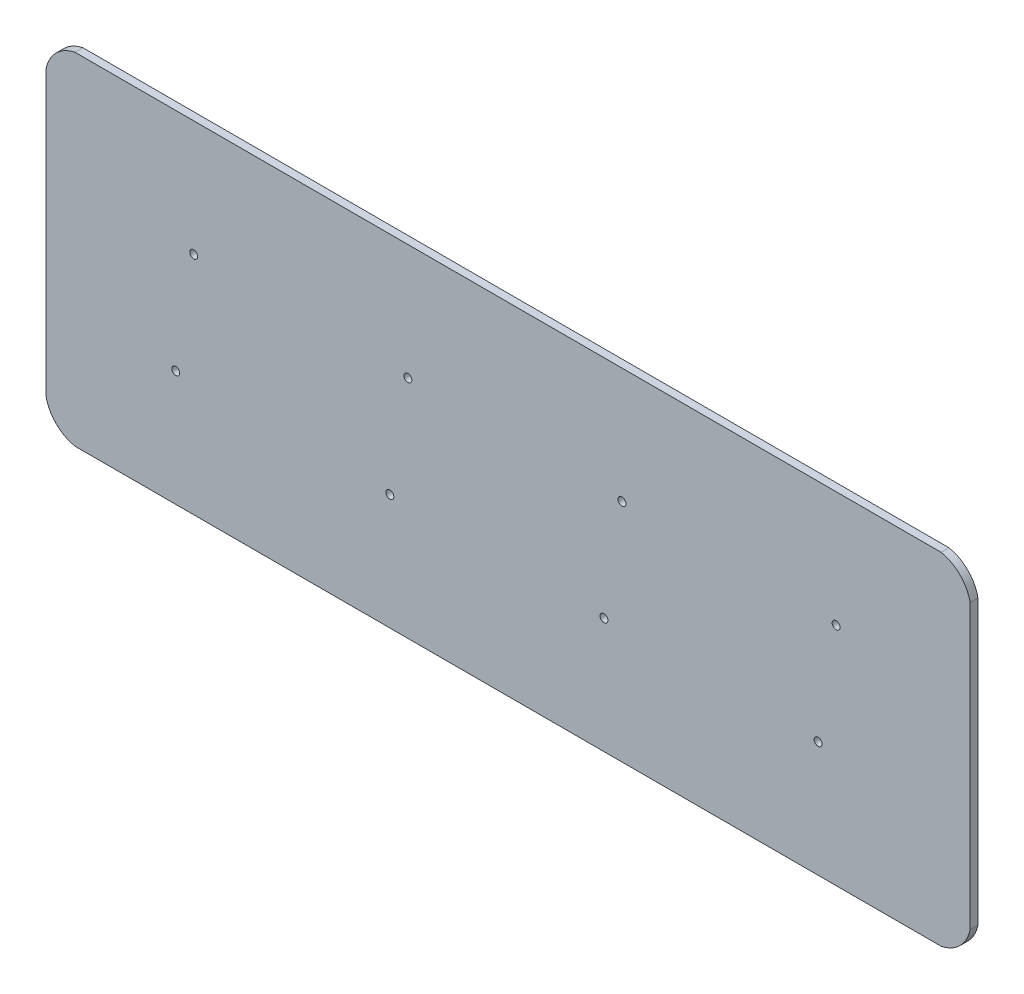
ISO-10303-21;
HEADER;
FILE_DESCRIPTION(('STEP AP214'),'2;1');
FILE_NAME('part.step','',(''),(''),'','','');
FILE_SCHEMA(('AUTOMOTIVE_DESIGN { 1 0 10303 214 1 1 1 1 }'));
ENDSEC;
DATA;
#1=APPLICATION_CONTEXT('core data for automotive mechanical design processes');
#2=APPLICATION_PROTOCOL_DEFINITION('international standard','automotive_design',2000,#1);
#3=PRODUCT_CONTEXT('',#1,'mechanical');
#4=PRODUCT('Part','Part','',(#3));
#5=PRODUCT_RELATED_PRODUCT_CATEGORY('part','',(#4));
#6=PRODUCT_DEFINITION_FORMATION('','',#4);
#7=PRODUCT_DEFINITION_CONTEXT('part definition',#1,'design');
#8=PRODUCT_DEFINITION('design','',#6,#7);
#9=PRODUCT_DEFINITION_SHAPE('','',#8);
#10=(LENGTH_UNIT() NAMED_UNIT(*) SI_UNIT(.MILLI.,.METRE.));
#11=(NAMED_UNIT(*) PLANE_ANGLE_UNIT() SI_UNIT($,.RADIAN.));
#12=(NAMED_UNIT(*) SI_UNIT($,.STERADIAN.) SOLID_ANGLE_UNIT());
#13=UNCERTAINTY_MEASURE_WITH_UNIT(LENGTH_MEASURE(1.E-05),#10,'distance_accuracy_value','');
#14=(GEOMETRIC_REPRESENTATION_CONTEXT(3) GLOBAL_UNCERTAINTY_ASSIGNED_CONTEXT((#13)) GLOBAL_UNIT_ASSIGNED_CONTEXT((#10,
#11,#12)) REPRESENTATION_CONTEXT('',''));
#15=CARTESIAN_POINT('',(0.,0.,0.));
#16=DIRECTION('',(0.,0.,1.));
#17=DIRECTION('',(1.,0.,0.));
#18=AXIS2_PLACEMENT_3D('',#15,#16,#17);
#19=CARTESIAN_POINT('',(167.144881817433,53.762164788374,3.));
#20=DIRECTION('',(0.,0.,1.));
#21=DIRECTION('',(1.,0.,0.));
#22=AXIS2_PLACEMENT_3D('',#19,#20,#21);
#23=PLANE('',#22);
#24=CARTESIAN_POINT('',(129.825109101699,23.4531392435407,3.));
#25=DIRECTION('',(0.,0.,1.));
#26=DIRECTION('',(1.,0.,0.));
#27=AXIS2_PLACEMENT_3D('',#24,#25,#26);
#28=CIRCLE('',#27,1.5);
#29=CARTESIAN_POINT('',(131.325109101699,23.4531392435407,3.));
#30=VERTEX_POINT('',#29);
#31=EDGE_CURVE('E215',#30,#30,#28,.T.);
#32=ORIENTED_EDGE('',*,*,#31,.F.);
#33=EDGE_LOOP('',(#32));
#34=FACE_BOUND('',#33,.T.);
#35=CARTESIAN_POINT('',(48.2351091016995,23.4531392435407,3.));
#36=DIRECTION('',(0.,0.,1.));
#37=DIRECTION('',(1.,0.,0.));
#38=AXIS2_PLACEMENT_3D('',#35,#36,#37);
#39=CIRCLE('',#38,1.5);
#40=CARTESIAN_POINT('',(49.7351091016995,23.4531392435407,3.));
#41=VERTEX_POINT('',#40);
#42=EDGE_CURVE('E203',#41,#41,#39,.T.);
#43=ORIENTED_EDGE('',*,*,#42,.F.);
#44=EDGE_LOOP('',(#43));
#45=FACE_BOUND('',#44,.T.);
#46=CARTESIAN_POINT('',(-33.3548908983005,23.4531392435407,3.));
#47=DIRECTION('',(0.,0.,1.));
#48=DIRECTION('',(1.,0.,0.));
#49=AXIS2_PLACEMENT_3D('',#46,#47,#48);
#50=CIRCLE('',#49,1.5);
#51=CARTESIAN_POINT('',(-31.8548908983005,23.4531392435407,3.));
#52=VERTEX_POINT('',#51);
#53=EDGE_CURVE('E191',#52,#52,#50,.T.);
#54=ORIENTED_EDGE('',*,*,#53,.F.);
#55=EDGE_LOOP('',(#54));
#56=FACE_BOUND('',#55,.T.);
#57=CARTESIAN_POINT('',(-114.944890898301,23.4531392435407,3.));
#58=DIRECTION('',(0.,0.,1.));
#59=DIRECTION('',(1.,0.,0.));
#60=AXIS2_PLACEMENT_3D('',#57,#58,#59);
#61=CIRCLE('',#60,1.5);
#62=CARTESIAN_POINT('',(-113.444890898301,23.4531392435407,3.));
#63=VERTEX_POINT('',#62);
#64=EDGE_CURVE('E137',#63,#63,#61,.T.);
#65=ORIENTED_EDGE('',*,*,#64,.F.);
#66=EDGE_LOOP('',(#65));
#67=FACE_BOUND('',#66,.T.);
#68=CARTESIAN_POINT('',(167.144881817433,53.762164788374,3.));
#69=DIRECTION('',(0.,0.,1.));
#70=DIRECTION('',(1.,0.,0.));
#71=AXIS2_PLACEMENT_3D('',#68,#69,#70);
#72=CIRCLE('',#71,14.0000000000001);
#73=CARTESIAN_POINT('',(180.8858562726,56.4427656580404,3.));
#74=VERTEX_POINT('',#73);
#75=CARTESIAN_POINT('',(169.825482687099,67.5031392435407,3.));
#76=VERTEX_POINT('',#75);
#77=EDGE_CURVE('E148',#74,#76,#72,.T.);
#78=ORIENTED_EDGE('',*,*,#77,.T.);
#79=DIRECTION('',(-1.,0.,0.));
#80=VECTOR('',#79,1.);
#81=CARTESIAN_POINT('',(169.825482687099,67.5031392435407,3.));
#82=LINE('',#81,#80);
#83=CARTESIAN_POINT('',(-160.174517312901,67.5031392435407,3.));
#84=VERTEX_POINT('',#83);
#85=EDGE_CURVE('E96',#76,#84,#82,.T.);
#86=ORIENTED_EDGE('',*,*,#85,.T.);
#87=CARTESIAN_POINT('',(-157.49391644315,53.7621647883903,3.));
#88=DIRECTION('',(0.,0.,1.));
#89=DIRECTION('',(1.,0.,0.));
#90=AXIS2_PLACEMENT_3D('',#87,#88,#89);
#91=CIRCLE('',#90,14.0000000000001);
#92=CARTESIAN_POINT('',(-171.234890898301,56.4427656581409,3.));
#93=VERTEX_POINT('',#92);
#94=EDGE_CURVE('E163',#84,#93,#91,.T.);
#95=ORIENTED_EDGE('',*,*,#94,.T.);
#96=DIRECTION('',(0.,-1.,0.));
#97=VECTOR('',#96,1.);
#98=CARTESIAN_POINT('',(-171.234890898301,56.4427656581409,3.));
#99=LINE('',#98,#97);
#100=CARTESIAN_POINT('',(-171.234890898301,-51.4364871710593,3.));
#101=VERTEX_POINT('',#100);
#102=EDGE_CURVE('E176',#93,#101,#99,.T.);
#103=ORIENTED_EDGE('',*,*,#102,.T.);
#104=CARTESIAN_POINT('',(-157.49391644315,-48.7558863013089,3.));
#105=DIRECTION('',(0.,0.,1.));
#106=DIRECTION('',(1.,0.,0.));
#107=AXIS2_PLACEMENT_3D('',#104,#105,#106);
#108=CIRCLE('',#107,14.);
#109=CARTESIAN_POINT('',(-160.1745173129,-62.4968607564593,3.));
#110=VERTEX_POINT('',#109);
#111=EDGE_CURVE('E115',#101,#110,#108,.T.);
#112=ORIENTED_EDGE('',*,*,#111,.T.);
#113=DIRECTION('',(1.,0.,0.));
#114=VECTOR('',#113,1.);
#115=CARTESIAN_POINT('',(-160.1745173129,-62.4968607564593,3.));
#116=LINE('',#115,#114);
#117=CARTESIAN_POINT('',(169.825482687099,-62.4968607564592,3.));
#118=VERTEX_POINT('',#117);
#119=EDGE_CURVE('E109',#110,#118,#116,.T.);
#120=ORIENTED_EDGE('',*,*,#119,.T.);
#121=CARTESIAN_POINT('',(167.144881817453,-48.7558863012886,3.));
#122=DIRECTION('',(0.,0.,1.));
#123=DIRECTION('',(1.,0.,0.));
#124=AXIS2_PLACEMENT_3D('',#121,#122,#123);
#125=CIRCLE('',#124,14.);
#126=CARTESIAN_POINT('',(180.8858562726,-51.4364871710588,3.));
#127=VERTEX_POINT('',#126);
#128=EDGE_CURVE('E113',#118,#127,#125,.T.);
#129=ORIENTED_EDGE('',*,*,#128,.T.);
#130=DIRECTION('',(0.,1.,0.));
#131=VECTOR('',#130,1.);
#132=CARTESIAN_POINT('',(180.8858562726,-51.4364871710588,3.));
#133=LINE('',#132,#131);
#134=EDGE_CURVE('E53',#127,#74,#133,.T.);
#135=ORIENTED_EDGE('',*,*,#134,.T.);
#136=EDGE_LOOP('',(#78,#86,#95,#103,#112,#120,#129,#135));
#137=FACE_BOUND('',#136,.T.);
#138=CARTESIAN_POINT('',(-121.804890898301,-18.4568607564593,3.));
#139=DIRECTION('',(0.,0.,1.));
#140=DIRECTION('',(1.,0.,0.));
#141=AXIS2_PLACEMENT_3D('',#138,#139,#140);
#142=CIRCLE('',#141,1.5);
#143=CARTESIAN_POINT('',(-120.304890898301,-18.4568607564593,3.));
#144=VERTEX_POINT('',#143);
#145=EDGE_CURVE('E185',#144,#144,#142,.T.);
#146=ORIENTED_EDGE('',*,*,#145,.F.);
#147=EDGE_LOOP('',(#146));
#148=FACE_BOUND('',#147,.T.);
#149=CARTESIAN_POINT('',(-40.2148908983005,-18.4568607564593,3.));
#150=DIRECTION('',(0.,0.,1.));
#151=DIRECTION('',(1.,0.,0.));
#152=AXIS2_PLACEMENT_3D('',#149,#150,#151);
#153=CIRCLE('',#152,1.5);
#154=CARTESIAN_POINT('',(-38.7148908983005,-18.4568607564593,3.));
#155=VERTEX_POINT('',#154);
#156=EDGE_CURVE('E197',#155,#155,#153,.T.);
#157=ORIENTED_EDGE('',*,*,#156,.F.);
#158=EDGE_LOOP('',(#157));
#159=FACE_BOUND('',#158,.T.);
#160=CARTESIAN_POINT('',(41.3751091016995,-18.4568607564593,3.));
#161=DIRECTION('',(0.,0.,1.));
#162=DIRECTION('',(1.,0.,0.));
#163=AXIS2_PLACEMENT_3D('',#160,#161,#162);
#164=CIRCLE('',#163,1.5);
#165=CARTESIAN_POINT('',(42.8751091016995,-18.4568607564593,3.));
#166=VERTEX_POINT('',#165);
#167=EDGE_CURVE('E209',#166,#166,#164,.T.);
#168=ORIENTED_EDGE('',*,*,#167,.F.);
#169=EDGE_LOOP('',(#168));
#170=FACE_BOUND('',#169,.T.);
#171=CARTESIAN_POINT('',(122.9651091017,-18.4568607564593,3.));
#172=DIRECTION('',(0.,0.,1.));
#173=DIRECTION('',(1.,0.,0.));
#174=AXIS2_PLACEMENT_3D('',#171,#172,#173);
#175=CIRCLE('',#174,1.5);
#176=CARTESIAN_POINT('',(124.4651091017,-18.4568607564593,3.));
#177=VERTEX_POINT('',#176);
#178=EDGE_CURVE('E221',#177,#177,#175,.T.);
#179=ORIENTED_EDGE('',*,*,#178,.F.);
#180=EDGE_LOOP('',(#179));
#181=FACE_BOUND('',#180,.T.);
#182=ADVANCED_FACE('F36',(#34,#45,#56,#67,#137,#148,#159,#170,#181),#23,.T.);
#183=CARTESIAN_POINT('',(167.144881817433,53.762164788374,0.));
#184=DIRECTION('',(0.,0.,1.));
#185=DIRECTION('',(1.,0.,0.));
#186=AXIS2_PLACEMENT_3D('',#183,#184,#185);
#187=PLANE('',#186);
#188=CARTESIAN_POINT('',(167.144881817433,53.762164788374,0.));
#189=DIRECTION('',(0.,0.,1.));
#190=DIRECTION('',(1.,0.,0.));
#191=AXIS2_PLACEMENT_3D('',#188,#189,#190);
#192=CIRCLE('',#191,14.0000000000001);
#193=CARTESIAN_POINT('',(180.8858562726,56.4427656580404,0.));
#194=VERTEX_POINT('',#193);
#195=CARTESIAN_POINT('',(169.825482687099,67.5031392435407,0.));
#196=VERTEX_POINT('',#195);
#197=EDGE_CURVE('E133',#194,#196,#192,.T.);
#198=ORIENTED_EDGE('',*,*,#197,.F.);
#199=DIRECTION('',(0.,1.,0.));
#200=VECTOR('',#199,1.);
#201=CARTESIAN_POINT('',(180.8858562726,-51.4364871710588,0.));
#202=LINE('',#201,#200);
#203=CARTESIAN_POINT('',(180.8858562726,-51.4364871710588,0.));
#204=VERTEX_POINT('',#203);
#205=EDGE_CURVE('E88',#204,#194,#202,.T.);
#206=ORIENTED_EDGE('',*,*,#205,.F.);
#207=CARTESIAN_POINT('',(167.144881817453,-48.7558863012886,0.));
#208=DIRECTION('',(0.,0.,1.));
#209=DIRECTION('',(1.,0.,0.));
#210=AXIS2_PLACEMENT_3D('',#207,#208,#209);
#211=CIRCLE('',#210,14.);
#212=CARTESIAN_POINT('',(169.825482687099,-62.4968607564592,0.));
#213=VERTEX_POINT('',#212);
#214=EDGE_CURVE('E82',#213,#204,#211,.T.);
#215=ORIENTED_EDGE('',*,*,#214,.F.);
#216=DIRECTION('',(1.,0.,0.));
#217=VECTOR('',#216,1.);
#218=CARTESIAN_POINT('',(-160.1745173129,-62.4968607564593,0.));
#219=LINE('',#218,#217);
#220=CARTESIAN_POINT('',(-160.1745173129,-62.4968607564593,0.));
#221=VERTEX_POINT('',#220);
#222=EDGE_CURVE('E123',#221,#213,#219,.T.);
#223=ORIENTED_EDGE('',*,*,#222,.F.);
#224=CARTESIAN_POINT('',(-157.49391644315,-48.7558863013089,0.));
#225=DIRECTION('',(0.,0.,1.));
#226=DIRECTION('',(1.,0.,0.));
#227=AXIS2_PLACEMENT_3D('',#224,#225,#226);
#228=CIRCLE('',#227,14.);
#229=CARTESIAN_POINT('',(-171.234890898301,-51.4364871710593,0.));
#230=VERTEX_POINT('',#229);
#231=EDGE_CURVE('E143',#230,#221,#228,.T.);
#232=ORIENTED_EDGE('',*,*,#231,.F.);
#233=DIRECTION('',(0.,-1.,0.));
#234=VECTOR('',#233,1.);
#235=CARTESIAN_POINT('',(-171.234890898301,56.4427656581409,0.));
#236=LINE('',#235,#234);
#237=CARTESIAN_POINT('',(-171.234890898301,56.4427656581409,0.));
#238=VERTEX_POINT('',#237);
#239=EDGE_CURVE('E141',#238,#230,#236,.T.);
#240=ORIENTED_EDGE('',*,*,#239,.F.);
#241=CARTESIAN_POINT('',(-157.49391644315,53.7621647883903,0.));
#242=DIRECTION('',(0.,0.,1.));
#243=DIRECTION('',(1.,0.,0.));
#244=AXIS2_PLACEMENT_3D('',#241,#242,#243);
#245=CIRCLE('',#244,14.0000000000001);
#246=CARTESIAN_POINT('',(-160.174517312901,67.5031392435407,0.));
#247=VERTEX_POINT('',#246);
#248=EDGE_CURVE('E139',#247,#238,#245,.T.);
#249=ORIENTED_EDGE('',*,*,#248,.F.);
#250=DIRECTION('',(-1.,0.,0.));
#251=VECTOR('',#250,1.);
#252=CARTESIAN_POINT('',(169.825482687099,67.5031392435407,0.));
#253=LINE('',#252,#251);
#254=EDGE_CURVE('E136',#196,#247,#253,.T.);
#255=ORIENTED_EDGE('',*,*,#254,.F.);
#256=EDGE_LOOP('',(#198,#206,#215,#223,#232,#240,#249,#255));
#257=FACE_BOUND('',#256,.T.);
#258=CARTESIAN_POINT('',(-114.944890898301,23.4531392435407,0.));
#259=DIRECTION('',(0.,0.,1.));
#260=DIRECTION('',(1.,0.,0.));
#261=AXIS2_PLACEMENT_3D('',#258,#259,#260);
#262=CIRCLE('',#261,1.5);
#263=CARTESIAN_POINT('',(-113.444890898301,23.4531392435407,0.));
#264=VERTEX_POINT('',#263);
#265=EDGE_CURVE('E182',#264,#264,#262,.T.);
#266=ORIENTED_EDGE('',*,*,#265,.T.);
#267=EDGE_LOOP('',(#266));
#268=FACE_BOUND('',#267,.T.);
#269=CARTESIAN_POINT('',(-121.804890898301,-18.4568607564593,0.));
#270=DIRECTION('',(0.,0.,1.));
#271=DIRECTION('',(1.,0.,0.));
#272=AXIS2_PLACEMENT_3D('',#269,#270,#271);
#273=CIRCLE('',#272,1.5);
#274=CARTESIAN_POINT('',(-120.304890898301,-18.4568607564593,0.));
#275=VERTEX_POINT('',#274);
#276=EDGE_CURVE('E188',#275,#275,#273,.T.);
#277=ORIENTED_EDGE('',*,*,#276,.T.);
#278=EDGE_LOOP('',(#277));
#279=FACE_BOUND('',#278,.T.);
#280=CARTESIAN_POINT('',(-33.3548908983005,23.4531392435407,0.));
#281=DIRECTION('',(0.,0.,1.));
#282=DIRECTION('',(1.,0.,0.));
#283=AXIS2_PLACEMENT_3D('',#280,#281,#282);
#284=CIRCLE('',#283,1.5);
#285=CARTESIAN_POINT('',(-31.8548908983005,23.4531392435407,0.));
#286=VERTEX_POINT('',#285);
#287=EDGE_CURVE('E194',#286,#286,#284,.T.);
#288=ORIENTED_EDGE('',*,*,#287,.T.);
#289=EDGE_LOOP('',(#288));
#290=FACE_BOUND('',#289,.T.);
#291=CARTESIAN_POINT('',(-40.2148908983005,-18.4568607564593,0.));
#292=DIRECTION('',(0.,0.,1.));
#293=DIRECTION('',(1.,0.,0.));
#294=AXIS2_PLACEMENT_3D('',#291,#292,#293);
#295=CIRCLE('',#294,1.5);
#296=CARTESIAN_POINT('',(-38.7148908983005,-18.4568607564593,0.));
#297=VERTEX_POINT('',#296);
#298=EDGE_CURVE('E200',#297,#297,#295,.T.);
#299=ORIENTED_EDGE('',*,*,#298,.T.);
#300=EDGE_LOOP('',(#299));
#301=FACE_BOUND('',#300,.T.);
#302=CARTESIAN_POINT('',(48.2351091016995,23.4531392435407,0.));
#303=DIRECTION('',(0.,0.,1.));
#304=DIRECTION('',(1.,0.,0.));
#305=AXIS2_PLACEMENT_3D('',#302,#303,#304);
#306=CIRCLE('',#305,1.5);
#307=CARTESIAN_POINT('',(49.7351091016995,23.4531392435407,0.));
#308=VERTEX_POINT('',#307);
#309=EDGE_CURVE('E206',#308,#308,#306,.T.);
#310=ORIENTED_EDGE('',*,*,#309,.T.);
#311=EDGE_LOOP('',(#310));
#312=FACE_BOUND('',#311,.T.);
#313=CARTESIAN_POINT('',(41.3751091016995,-18.4568607564593,0.));
#314=DIRECTION('',(0.,0.,1.));
#315=DIRECTION('',(1.,0.,0.));
#316=AXIS2_PLACEMENT_3D('',#313,#314,#315);
#317=CIRCLE('',#316,1.5);
#318=CARTESIAN_POINT('',(42.8751091016995,-18.4568607564593,0.));
#319=VERTEX_POINT('',#318);
#320=EDGE_CURVE('E212',#319,#319,#317,.T.);
#321=ORIENTED_EDGE('',*,*,#320,.T.);
#322=EDGE_LOOP('',(#321));
#323=FACE_BOUND('',#322,.T.);
#324=CARTESIAN_POINT('',(129.825109101699,23.4531392435407,0.));
#325=DIRECTION('',(0.,0.,1.));
#326=DIRECTION('',(1.,0.,0.));
#327=AXIS2_PLACEMENT_3D('',#324,#325,#326);
#328=CIRCLE('',#327,1.5);
#329=CARTESIAN_POINT('',(131.325109101699,23.4531392435407,0.));
#330=VERTEX_POINT('',#329);
#331=EDGE_CURVE('E218',#330,#330,#328,.T.);
#332=ORIENTED_EDGE('',*,*,#331,.T.);
#333=EDGE_LOOP('',(#332));
#334=FACE_BOUND('',#333,.T.);
#335=CARTESIAN_POINT('',(122.9651091017,-18.4568607564593,0.));
#336=DIRECTION('',(0.,0.,1.));
#337=DIRECTION('',(1.,0.,0.));
#338=AXIS2_PLACEMENT_3D('',#335,#336,#337);
#339=CIRCLE('',#338,1.5);
#340=CARTESIAN_POINT('',(124.4651091017,-18.4568607564593,0.));
#341=VERTEX_POINT('',#340);
#342=EDGE_CURVE('E224',#341,#341,#339,.T.);
#343=ORIENTED_EDGE('',*,*,#342,.T.);
#344=EDGE_LOOP('',(#343));
#345=FACE_BOUND('',#344,.T.);
#346=ADVANCED_FACE('F167',(#257,#268,#279,#290,#301,#312,#323,#334,#345),#187,.F.);
#347=CARTESIAN_POINT('',(167.144881817433,53.762164788374,3.));
#348=DIRECTION('',(0.,0.,-1.));
#349=DIRECTION('',(-1.,0.,0.));
#350=AXIS2_PLACEMENT_3D('',#347,#348,#349);
#351=CYLINDRICAL_SURFACE('',#350,14.0000000000001);
#352=ORIENTED_EDGE('',*,*,#197,.T.);
#353=DIRECTION('',(0.,0.,-1.));
#354=VECTOR('',#353,1.);
#355=CARTESIAN_POINT('',(169.825482687099,67.5031392435407,3.));
#356=LINE('',#355,#354);
#357=EDGE_CURVE('E11',#76,#196,#356,.T.);
#358=ORIENTED_EDGE('',*,*,#357,.F.);
#359=ORIENTED_EDGE('',*,*,#77,.F.);
#360=DIRECTION('',(0.,0.,-1.));
#361=VECTOR('',#360,1.);
#362=CARTESIAN_POINT('',(180.8858562726,56.4427656580404,3.));
#363=LINE('',#362,#361);
#364=EDGE_CURVE('E129',#74,#194,#363,.T.);
#365=ORIENTED_EDGE('',*,*,#364,.T.);
#366=EDGE_LOOP('',(#352,#358,#359,#365));
#367=FACE_BOUND('',#366,.T.);
#368=ADVANCED_FACE('F38',(#367),#351,.T.);
#369=CARTESIAN_POINT('',(169.825482687099,67.5031392435407,3.));
#370=DIRECTION('',(0.,-1.,0.));
#371=DIRECTION('',(0.,0.,-1.));
#372=AXIS2_PLACEMENT_3D('',#369,#370,#371);
#373=PLANE('',#372);
#374=ORIENTED_EDGE('',*,*,#254,.T.);
#375=DIRECTION('',(0.,0.,-1.));
#376=VECTOR('',#375,1.);
#377=CARTESIAN_POINT('',(-160.174517312901,67.5031392435407,3.));
#378=LINE('',#377,#376);
#379=EDGE_CURVE('E45',#84,#247,#378,.T.);
#380=ORIENTED_EDGE('',*,*,#379,.F.);
#381=ORIENTED_EDGE('',*,*,#85,.F.);
#382=ORIENTED_EDGE('',*,*,#357,.T.);
#383=EDGE_LOOP('',(#374,#380,#381,#382));
#384=FACE_BOUND('',#383,.T.);
#385=ADVANCED_FACE('F258',(#384),#373,.F.);
#386=CARTESIAN_POINT('',(-157.49391644315,53.7621647883903,3.));
#387=DIRECTION('',(0.,0.,-1.));
#388=DIRECTION('',(-1.,0.,0.));
#389=AXIS2_PLACEMENT_3D('',#386,#387,#388);
#390=CYLINDRICAL_SURFACE('',#389,14.0000000000001);
#391=ORIENTED_EDGE('',*,*,#248,.T.);
#392=DIRECTION('',(0.,0.,-1.));
#393=VECTOR('',#392,1.);
#394=CARTESIAN_POINT('',(-171.234890898301,56.4427656581409,3.));
#395=LINE('',#394,#393);
#396=EDGE_CURVE('E155',#93,#238,#395,.T.);
#397=ORIENTED_EDGE('',*,*,#396,.F.);
#398=ORIENTED_EDGE('',*,*,#94,.F.);
#399=ORIENTED_EDGE('',*,*,#379,.T.);
#400=EDGE_LOOP('',(#391,#397,#398,#399));
#401=FACE_BOUND('',#400,.T.);
#402=ADVANCED_FACE('F161',(#401),#390,.T.);
#403=CARTESIAN_POINT('',(-171.234890898301,56.4427656581409,3.));
#404=DIRECTION('',(1.,0.,0.));
#405=DIRECTION('',(0.,0.,-1.));
#406=AXIS2_PLACEMENT_3D('',#403,#404,#405);
#407=PLANE('',#406);
#408=ORIENTED_EDGE('',*,*,#239,.T.);
#409=DIRECTION('',(0.,0.,-1.));
#410=VECTOR('',#409,1.);
#411=CARTESIAN_POINT('',(-171.234890898301,-51.4364871710593,3.));
#412=LINE('',#411,#410);
#413=EDGE_CURVE('E152',#101,#230,#412,.T.);
#414=ORIENTED_EDGE('',*,*,#413,.F.);
#415=ORIENTED_EDGE('',*,*,#102,.F.);
#416=ORIENTED_EDGE('',*,*,#396,.T.);
#417=EDGE_LOOP('',(#408,#414,#415,#416));
#418=FACE_BOUND('',#417,.T.);
#419=ADVANCED_FACE('F172',(#418),#407,.F.);
#420=CARTESIAN_POINT('',(-157.49391644315,-48.7558863013089,3.));
#421=DIRECTION('',(0.,0.,-1.));
#422=DIRECTION('',(-1.,0.,0.));
#423=AXIS2_PLACEMENT_3D('',#420,#421,#422);
#424=CYLINDRICAL_SURFACE('',#423,14.);
#425=ORIENTED_EDGE('',*,*,#231,.T.);
#426=DIRECTION('',(0.,0.,-1.));
#427=VECTOR('',#426,1.);
#428=CARTESIAN_POINT('',(-160.1745173129,-62.4968607564593,3.));
#429=LINE('',#428,#427);
#430=EDGE_CURVE('E124',#110,#221,#429,.T.);
#431=ORIENTED_EDGE('',*,*,#430,.F.);
#432=ORIENTED_EDGE('',*,*,#111,.F.);
#433=ORIENTED_EDGE('',*,*,#413,.T.);
#434=EDGE_LOOP('',(#425,#431,#432,#433));
#435=FACE_BOUND('',#434,.T.);
#436=ADVANCED_FACE('F175',(#435),#424,.T.);
#437=CARTESIAN_POINT('',(-160.1745173129,-62.4968607564593,3.));
#438=DIRECTION('',(0.,1.,0.));
#439=DIRECTION('',(-1.,0.,0.));
#440=AXIS2_PLACEMENT_3D('',#437,#438,#439);
#441=PLANE('',#440);
#442=ORIENTED_EDGE('',*,*,#222,.T.);
#443=DIRECTION('',(0.,0.,-1.));
#444=VECTOR('',#443,1.);
#445=CARTESIAN_POINT('',(169.825482687099,-62.4968607564592,3.));
#446=LINE('',#445,#444);
#447=EDGE_CURVE('E120',#118,#213,#446,.T.);
#448=ORIENTED_EDGE('',*,*,#447,.F.);
#449=ORIENTED_EDGE('',*,*,#119,.F.);
#450=ORIENTED_EDGE('',*,*,#430,.T.);
#451=EDGE_LOOP('',(#442,#448,#449,#450));
#452=FACE_BOUND('',#451,.T.);
#453=ADVANCED_FACE('F121',(#452),#441,.F.);
#454=CARTESIAN_POINT('',(167.144881817453,-48.7558863012886,3.));
#455=DIRECTION('',(0.,0.,-1.));
#456=DIRECTION('',(-1.,0.,0.));
#457=AXIS2_PLACEMENT_3D('',#454,#455,#456);
#458=CYLINDRICAL_SURFACE('',#457,14.);
#459=ORIENTED_EDGE('',*,*,#214,.T.);
#460=DIRECTION('',(0.,0.,-1.));
#461=VECTOR('',#460,1.);
#462=CARTESIAN_POINT('',(180.8858562726,-51.4364871710588,3.));
#463=LINE('',#462,#461);
#464=EDGE_CURVE('E125',#127,#204,#463,.T.);
#465=ORIENTED_EDGE('',*,*,#464,.F.);
#466=ORIENTED_EDGE('',*,*,#128,.F.);
#467=ORIENTED_EDGE('',*,*,#447,.T.);
#468=EDGE_LOOP('',(#459,#465,#466,#467));
#469=FACE_BOUND('',#468,.T.);
#470=ADVANCED_FACE('F127',(#469),#458,.T.);
#471=CARTESIAN_POINT('',(180.8858562726,-51.4364871710588,3.));
#472=DIRECTION('',(-1.,0.,0.));
#473=DIRECTION('',(0.,0.,1.));
#474=AXIS2_PLACEMENT_3D('',#471,#472,#473);
#475=PLANE('',#474);
#476=ORIENTED_EDGE('',*,*,#205,.T.);
#477=ORIENTED_EDGE('',*,*,#364,.F.);
#478=ORIENTED_EDGE('',*,*,#134,.F.);
#479=ORIENTED_EDGE('',*,*,#464,.T.);
#480=EDGE_LOOP('',(#476,#477,#478,#479));
#481=FACE_BOUND('',#480,.T.);
#482=ADVANCED_FACE('F246',(#481),#475,.F.);
#483=CARTESIAN_POINT('',(-114.944890898301,23.4531392435407,3.));
#484=DIRECTION('',(0.,0.,-1.));
#485=DIRECTION('',(-1.,0.,0.));
#486=AXIS2_PLACEMENT_3D('',#483,#484,#485);
#487=CYLINDRICAL_SURFACE('',#486,1.5);
#488=ORIENTED_EDGE('',*,*,#64,.T.);
#489=EDGE_LOOP('',(#488));
#490=FACE_BOUND('',#489,.T.);
#491=ORIENTED_EDGE('',*,*,#265,.F.);
#492=EDGE_LOOP('',(#491));
#493=FACE_BOUND('',#492,.T.);
#494=ADVANCED_FACE('F243',(#490,#493),#487,.F.);
#495=CARTESIAN_POINT('',(-121.804890898301,-18.4568607564593,3.));
#496=DIRECTION('',(0.,0.,-1.));
#497=DIRECTION('',(-1.,0.,0.));
#498=AXIS2_PLACEMENT_3D('',#495,#496,#497);
#499=CYLINDRICAL_SURFACE('',#498,1.5);
#500=ORIENTED_EDGE('',*,*,#145,.T.);
#501=EDGE_LOOP('',(#500));
#502=FACE_BOUND('',#501,.T.);
#503=ORIENTED_EDGE('',*,*,#276,.F.);
#504=EDGE_LOOP('',(#503));
#505=FACE_BOUND('',#504,.T.);
#506=ADVANCED_FACE('F322',(#502,#505),#499,.F.);
#507=CARTESIAN_POINT('',(-33.3548908983005,23.4531392435407,3.));
#508=DIRECTION('',(0.,0.,-1.));
#509=DIRECTION('',(-1.,0.,0.));
#510=AXIS2_PLACEMENT_3D('',#507,#508,#509);
#511=CYLINDRICAL_SURFACE('',#510,1.5);
#512=ORIENTED_EDGE('',*,*,#53,.T.);
#513=EDGE_LOOP('',(#512));
#514=FACE_BOUND('',#513,.T.);
#515=ORIENTED_EDGE('',*,*,#287,.F.);
#516=EDGE_LOOP('',(#515));
#517=FACE_BOUND('',#516,.T.);
#518=ADVANCED_FACE('F330',(#514,#517),#511,.F.);
#519=CARTESIAN_POINT('',(-40.2148908983005,-18.4568607564593,3.));
#520=DIRECTION('',(0.,0.,-1.));
#521=DIRECTION('',(-1.,0.,0.));
#522=AXIS2_PLACEMENT_3D('',#519,#520,#521);
#523=CYLINDRICAL_SURFACE('',#522,1.5);
#524=ORIENTED_EDGE('',*,*,#156,.T.);
#525=EDGE_LOOP('',(#524));
#526=FACE_BOUND('',#525,.T.);
#527=ORIENTED_EDGE('',*,*,#298,.F.);
#528=EDGE_LOOP('',(#527));
#529=FACE_BOUND('',#528,.T.);
#530=ADVANCED_FACE('F338',(#526,#529),#523,.F.);
#531=CARTESIAN_POINT('',(48.2351091016995,23.4531392435407,3.));
#532=DIRECTION('',(0.,0.,-1.));
#533=DIRECTION('',(-1.,0.,0.));
#534=AXIS2_PLACEMENT_3D('',#531,#532,#533);
#535=CYLINDRICAL_SURFACE('',#534,1.5);
#536=ORIENTED_EDGE('',*,*,#42,.T.);
#537=EDGE_LOOP('',(#536));
#538=FACE_BOUND('',#537,.T.);
#539=ORIENTED_EDGE('',*,*,#309,.F.);
#540=EDGE_LOOP('',(#539));
#541=FACE_BOUND('',#540,.T.);
#542=ADVANCED_FACE('F347',(#538,#541),#535,.F.);
#543=CARTESIAN_POINT('',(41.3751091016995,-18.4568607564593,3.));
#544=DIRECTION('',(0.,0.,-1.));
#545=DIRECTION('',(-1.,0.,0.));
#546=AXIS2_PLACEMENT_3D('',#543,#544,#545);
#547=CYLINDRICAL_SURFACE('',#546,1.5);
#548=ORIENTED_EDGE('',*,*,#167,.T.);
#549=EDGE_LOOP('',(#548));
#550=FACE_BOUND('',#549,.T.);
#551=ORIENTED_EDGE('',*,*,#320,.F.);
#552=EDGE_LOOP('',(#551));
#553=FACE_BOUND('',#552,.T.);
#554=ADVANCED_FACE('F356',(#550,#553),#547,.F.);
#555=CARTESIAN_POINT('',(129.825109101699,23.4531392435407,3.));
#556=DIRECTION('',(0.,0.,-1.));
#557=DIRECTION('',(-1.,0.,0.));
#558=AXIS2_PLACEMENT_3D('',#555,#556,#557);
#559=CYLINDRICAL_SURFACE('',#558,1.5);
#560=ORIENTED_EDGE('',*,*,#31,.T.);
#561=EDGE_LOOP('',(#560));
#562=FACE_BOUND('',#561,.T.);
#563=ORIENTED_EDGE('',*,*,#331,.F.);
#564=EDGE_LOOP('',(#563));
#565=FACE_BOUND('',#564,.T.);
#566=ADVANCED_FACE('F365',(#562,#565),#559,.F.);
#567=CARTESIAN_POINT('',(122.9651091017,-18.4568607564593,3.));
#568=DIRECTION('',(0.,0.,-1.));
#569=DIRECTION('',(-1.,0.,0.));
#570=AXIS2_PLACEMENT_3D('',#567,#568,#569);
#571=CYLINDRICAL_SURFACE('',#570,1.5);
#572=ORIENTED_EDGE('',*,*,#178,.T.);
#573=EDGE_LOOP('',(#572));
#574=FACE_BOUND('',#573,.T.);
#575=ORIENTED_EDGE('',*,*,#342,.F.);
#576=EDGE_LOOP('',(#575));
#577=FACE_BOUND('',#576,.T.);
#578=ADVANCED_FACE('F230',(#574,#577),#571,.F.);
#579=CLOSED_SHELL('',(#182,#346,#368,#385,#402,#419,#436,#453,#470,#482,#494,#506,#518,#530,
#542,#554,#566,#578));
#580=MANIFOLD_SOLID_BREP('B2',#579);
#581=ADVANCED_BREP_SHAPE_REPRESENTATION('',(#18,#580),#14);
#582=SHAPE_DEFINITION_REPRESENTATION(#9,#581);
ENDSEC;
END-ISO-10303-21;
